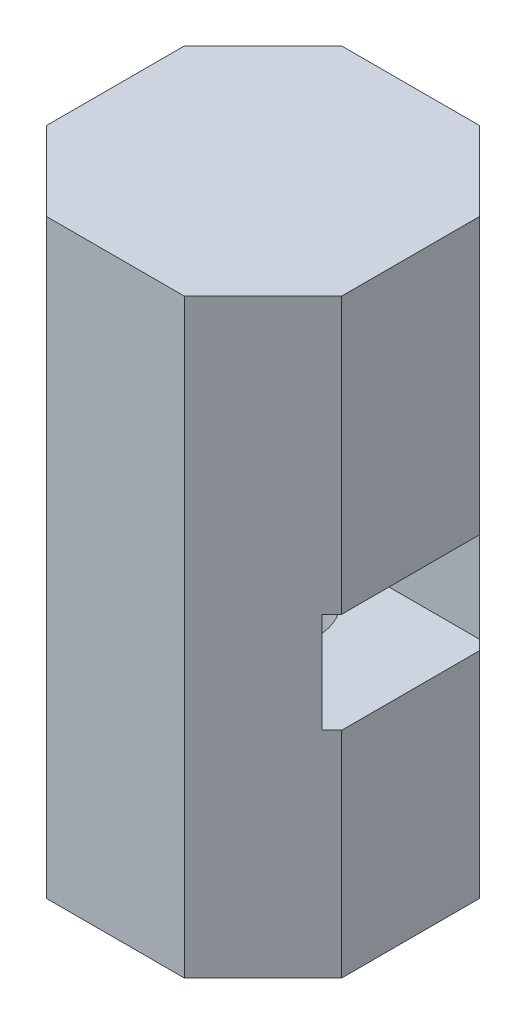
ISO-10303-21;
HEADER;
FILE_DESCRIPTION(('STEP AP214'),'2;1');
FILE_NAME('part.step','',(''),(''),'','','');
FILE_SCHEMA(('AUTOMOTIVE_DESIGN { 1 0 10303 214 1 1 1 1 }'));
ENDSEC;
DATA;
#1=APPLICATION_CONTEXT('core data for automotive mechanical design processes');
#2=APPLICATION_PROTOCOL_DEFINITION('international standard','automotive_design',2000,#1);
#3=PRODUCT_CONTEXT('',#1,'mechanical');
#4=PRODUCT('Part','Part','',(#3));
#5=PRODUCT_RELATED_PRODUCT_CATEGORY('part','',(#4));
#6=PRODUCT_DEFINITION_FORMATION('','',#4);
#7=PRODUCT_DEFINITION_CONTEXT('part definition',#1,'design');
#8=PRODUCT_DEFINITION('design','',#6,#7);
#9=PRODUCT_DEFINITION_SHAPE('','',#8);
#10=(LENGTH_UNIT() NAMED_UNIT(*) SI_UNIT(.MILLI.,.METRE.));
#11=(NAMED_UNIT(*) PLANE_ANGLE_UNIT() SI_UNIT($,.RADIAN.));
#12=(NAMED_UNIT(*) SI_UNIT($,.STERADIAN.) SOLID_ANGLE_UNIT());
#13=UNCERTAINTY_MEASURE_WITH_UNIT(LENGTH_MEASURE(1.E-05),#10,'distance_accuracy_value','');
#14=(GEOMETRIC_REPRESENTATION_CONTEXT(3) GLOBAL_UNCERTAINTY_ASSIGNED_CONTEXT((#13)) GLOBAL_UNIT_ASSIGNED_CONTEXT((#10,
#11,#12)) REPRESENTATION_CONTEXT('',''));
#15=CARTESIAN_POINT('',(0.,0.,0.));
#16=DIRECTION('',(0.,0.,1.));
#17=DIRECTION('',(1.,0.,0.));
#18=AXIS2_PLACEMENT_3D('',#15,#16,#17);
#19=CARTESIAN_POINT('',(3.99999999999999,0.,7.5));
#20=DIRECTION('',(-1.,0.,0.));
#21=DIRECTION('',(0.,-1.,0.));
#22=AXIS2_PLACEMENT_3D('',#19,#20,#21);
#23=PLANE('',#22);
#24=DIRECTION('',(0.,0.,-1.));
#25=VECTOR('',#24,1.);
#26=CARTESIAN_POINT('',(4.,-30.,7.5));
#27=LINE('',#26,#25);
#28=CARTESIAN_POINT('',(4.,-30.,3.49999999999997));
#29=VERTEX_POINT('',#28);
#30=CARTESIAN_POINT('',(4.,-30.,-3.49999999999992));
#31=VERTEX_POINT('',#30);
#32=EDGE_CURVE('E185',#29,#31,#27,.T.);
#33=ORIENTED_EDGE('',*,*,#32,.T.);
#34=DIRECTION('',(0.,1.,0.));
#35=VECTOR('',#34,1.);
#36=CARTESIAN_POINT('',(3.99999999999999,0.,-3.49999999999993));
#37=LINE('',#36,#35);
#38=CARTESIAN_POINT('',(3.99999999999999,-19.1,-3.49999999999994));
#39=VERTEX_POINT('',#38);
#40=EDGE_CURVE('E11',#31,#39,#37,.T.);
#41=ORIENTED_EDGE('',*,*,#40,.T.);
#42=DIRECTION('',(0.,0.,-1.));
#43=VECTOR('',#42,1.);
#44=CARTESIAN_POINT('',(3.99999999999999,-19.1,4.));
#45=LINE('',#44,#43);
#46=CARTESIAN_POINT('',(3.99999999999999,-19.1,3.49999999999997));
#47=VERTEX_POINT('',#46);
#48=EDGE_CURVE('E259',#47,#39,#45,.T.);
#49=ORIENTED_EDGE('',*,*,#48,.F.);
#50=DIRECTION('',(0.,-1.,0.));
#51=VECTOR('',#50,1.);
#52=CARTESIAN_POINT('',(3.99999999999999,0.,3.49999999999997));
#53=LINE('',#52,#51);
#54=EDGE_CURVE('E246',#47,#29,#53,.T.);
#55=ORIENTED_EDGE('',*,*,#54,.T.);
#56=EDGE_LOOP('',(#33,#41,#49,#55));
#57=FACE_BOUND('',#56,.T.);
#58=ADVANCED_FACE('F33',(#57),#23,.F.);
#59=CARTESIAN_POINT('',(-11.,-30.,7.5));
#60=DIRECTION('',(1.,0.,0.));
#61=DIRECTION('',(0.,1.,0.));
#62=AXIS2_PLACEMENT_3D('',#59,#60,#61);
#63=PLANE('',#62);
#64=DIRECTION('',(0.,0.,-1.));
#65=VECTOR('',#64,1.);
#66=CARTESIAN_POINT('',(-11.,-30.,7.5));
#67=LINE('',#66,#65);
#68=CARTESIAN_POINT('',(-11.,-30.,3.49999999999997));
#69=VERTEX_POINT('',#68);
#70=CARTESIAN_POINT('',(-11.,-30.,-3.49999999999992));
#71=VERTEX_POINT('',#70);
#72=EDGE_CURVE('E188',#69,#71,#67,.T.);
#73=ORIENTED_EDGE('',*,*,#72,.F.);
#74=DIRECTION('',(0.,1.,0.));
#75=VECTOR('',#74,1.);
#76=CARTESIAN_POINT('',(-11.,-30.,3.49999999999997));
#77=LINE('',#76,#75);
#78=CARTESIAN_POINT('',(-11.,-19.1,3.49999999999997));
#79=VERTEX_POINT('',#78);
#80=EDGE_CURVE('E213',#69,#79,#77,.T.);
#81=ORIENTED_EDGE('',*,*,#80,.T.);
#82=DIRECTION('',(0.,0.,1.));
#83=VECTOR('',#82,1.);
#84=CARTESIAN_POINT('',(-11.,-19.1,4.));
#85=LINE('',#84,#83);
#86=CARTESIAN_POINT('',(-11.,-19.1,-3.49999999999993));
#87=VERTEX_POINT('',#86);
#88=EDGE_CURVE('E287',#87,#79,#85,.T.);
#89=ORIENTED_EDGE('',*,*,#88,.F.);
#90=DIRECTION('',(0.,-1.,0.));
#91=VECTOR('',#90,1.);
#92=CARTESIAN_POINT('',(-11.,-30.,-3.49999999999993));
#93=LINE('',#92,#91);
#94=EDGE_CURVE('E206',#87,#71,#93,.T.);
#95=ORIENTED_EDGE('',*,*,#94,.T.);
#96=EDGE_LOOP('',(#73,#81,#89,#95));
#97=FACE_BOUND('',#96,.T.);
#98=ADVANCED_FACE('F343',(#97),#63,.F.);
#99=CARTESIAN_POINT('',(-11.,0.,7.5));
#100=DIRECTION('',(0.,-1.,0.));
#101=DIRECTION('',(1.,0.,0.));
#102=AXIS2_PLACEMENT_3D('',#99,#100,#101);
#103=PLANE('',#102);
#104=DIRECTION('',(0.,0.,-1.));
#105=VECTOR('',#104,1.);
#106=CARTESIAN_POINT('',(-11.,0.,7.5));
#107=LINE('',#106,#105);
#108=CARTESIAN_POINT('',(-11.,0.,3.49999999999997));
#109=VERTEX_POINT('',#108);
#110=CARTESIAN_POINT('',(-11.,0.,-3.49999999999992));
#111=VERTEX_POINT('',#110);
#112=EDGE_CURVE('E164',#109,#111,#107,.T.);
#113=ORIENTED_EDGE('',*,*,#112,.F.);
#114=DIRECTION('',(-0.707106781186551,0.,-0.707106781186544));
#115=VECTOR('',#114,1.);
#116=CARTESIAN_POINT('',(-6.99999999999992,0.,7.5));
#117=LINE('',#116,#115);
#118=CARTESIAN_POINT('',(-6.99999999999992,0.,7.5));
#119=VERTEX_POINT('',#118);
#120=EDGE_CURVE('E169',#109,#119,#117,.F.);
#121=ORIENTED_EDGE('',*,*,#120,.T.);
#122=DIRECTION('',(-1.,0.,0.));
#123=VECTOR('',#122,1.);
#124=CARTESIAN_POINT('',(-11.,0.,7.5));
#125=LINE('',#124,#123);
#126=CARTESIAN_POINT('',(0.,0.,7.5));
#127=VERTEX_POINT('',#126);
#128=EDGE_CURVE('E159',#127,#119,#125,.T.);
#129=ORIENTED_EDGE('',*,*,#128,.F.);
#130=DIRECTION('',(-0.707106781186551,0.,0.707106781186544));
#131=VECTOR('',#130,1.);
#132=CARTESIAN_POINT('',(0.,0.,7.5));
#133=LINE('',#132,#131);
#134=CARTESIAN_POINT('',(3.99999999999999,0.,3.49999999999997));
#135=VERTEX_POINT('',#134);
#136=EDGE_CURVE('E54',#127,#135,#133,.F.);
#137=ORIENTED_EDGE('',*,*,#136,.T.);
#138=DIRECTION('',(0.,0.,-1.));
#139=VECTOR('',#138,1.);
#140=CARTESIAN_POINT('',(3.99999999999999,0.,7.5));
#141=LINE('',#140,#139);
#142=CARTESIAN_POINT('',(3.99999999999999,0.,-3.49999999999992));
#143=VERTEX_POINT('',#142);
#144=EDGE_CURVE('E172',#135,#143,#141,.T.);
#145=ORIENTED_EDGE('',*,*,#144,.T.);
#146=DIRECTION('',(-0.707106781186544,0.,-0.707106781186551));
#147=VECTOR('',#146,1.);
#148=CARTESIAN_POINT('',(3.99999999999999,0.,-3.49999999999993));
#149=LINE('',#148,#147);
#150=CARTESIAN_POINT('',(0.,0.,-7.5));
#151=VERTEX_POINT('',#150);
#152=EDGE_CURVE('E151',#143,#151,#149,.T.);
#153=ORIENTED_EDGE('',*,*,#152,.T.);
#154=DIRECTION('',(-1.,0.,0.));
#155=VECTOR('',#154,1.);
#156=CARTESIAN_POINT('',(-11.,0.,-7.5));
#157=LINE('',#156,#155);
#158=CARTESIAN_POINT('',(-6.99999999999997,0.,-7.5));
#159=VERTEX_POINT('',#158);
#160=EDGE_CURVE('E175',#151,#159,#157,.T.);
#161=ORIENTED_EDGE('',*,*,#160,.T.);
#162=DIRECTION('',(-0.707106781186544,0.,0.707106781186551));
#163=VECTOR('',#162,1.);
#164=CARTESIAN_POINT('',(-11.,0.,-3.49999999999993));
#165=LINE('',#164,#163);
#166=EDGE_CURVE('E235',#159,#111,#165,.T.);
#167=ORIENTED_EDGE('',*,*,#166,.T.);
#168=EDGE_LOOP('',(#113,#121,#129,#137,#145,#153,#161,#167));
#169=FACE_BOUND('',#168,.T.);
#170=ADVANCED_FACE('F167',(#169),#103,.F.);
#171=DIRECTION('',(0.,0.,-1.));
#172=VECTOR('',#171,1.);
#173=CARTESIAN_POINT('',(-11.,-14.,4.));
#174=LINE('',#173,#172);
#175=CARTESIAN_POINT('',(-11.,-14.,3.49999999999997));
#176=VERTEX_POINT('',#175);
#177=CARTESIAN_POINT('',(-11.,-14.,-3.49999999999993));
#178=VERTEX_POINT('',#177);
#179=EDGE_CURVE('E308',#176,#178,#174,.T.);
#180=ORIENTED_EDGE('',*,*,#179,.F.);
#181=DIRECTION('',(0.,1.,0.));
#182=VECTOR('',#181,1.);
#183=CARTESIAN_POINT('',(-11.,-30.,3.49999999999997));
#184=LINE('',#183,#182);
#185=EDGE_CURVE('E211',#176,#109,#184,.T.);
#186=ORIENTED_EDGE('',*,*,#185,.T.);
#187=ORIENTED_EDGE('',*,*,#112,.T.);
#188=DIRECTION('',(0.,-1.,0.));
#189=VECTOR('',#188,1.);
#190=CARTESIAN_POINT('',(-11.,-30.,-3.49999999999993));
#191=LINE('',#190,#189);
#192=EDGE_CURVE('E208',#111,#178,#191,.T.);
#193=ORIENTED_EDGE('',*,*,#192,.T.);
#194=EDGE_LOOP('',(#180,#186,#187,#193));
#195=FACE_BOUND('',#194,.T.);
#196=ADVANCED_FACE('F302',(#195),#63,.F.);
#197=CARTESIAN_POINT('',(4.,-30.,7.5));
#198=DIRECTION('',(0.,1.,0.));
#199=DIRECTION('',(-1.,0.,0.));
#200=AXIS2_PLACEMENT_3D('',#197,#198,#199);
#201=PLANE('',#200);
#202=CARTESIAN_POINT('',(-3.5,-30.,0.));
#203=DIRECTION('',(0.,-1.,0.));
#204=DIRECTION('',(1.,0.,0.));
#205=AXIS2_PLACEMENT_3D('',#202,#203,#204);
#206=CIRCLE('',#205,5.25);
#207=CARTESIAN_POINT('',(1.75,-30.,0.));
#208=VERTEX_POINT('',#207);
#209=EDGE_CURVE('E178',#208,#208,#206,.T.);
#210=ORIENTED_EDGE('',*,*,#209,.F.);
#211=EDGE_LOOP('',(#210));
#212=FACE_BOUND('',#211,.T.);
#213=DIRECTION('',(1.,0.,0.));
#214=VECTOR('',#213,1.);
#215=CARTESIAN_POINT('',(4.,-30.,7.5));
#216=LINE('',#215,#214);
#217=CARTESIAN_POINT('',(-6.99999999999992,-30.,7.5));
#218=VERTEX_POINT('',#217);
#219=CARTESIAN_POINT('',(0.,-30.,7.5));
#220=VERTEX_POINT('',#219);
#221=EDGE_CURVE('E162',#218,#220,#216,.T.);
#222=ORIENTED_EDGE('',*,*,#221,.F.);
#223=DIRECTION('',(0.707106781186551,0.,0.707106781186544));
#224=VECTOR('',#223,1.);
#225=CARTESIAN_POINT('',(-6.99999999999992,-30.,7.5));
#226=LINE('',#225,#224);
#227=EDGE_CURVE('E204',#218,#69,#226,.F.);
#228=ORIENTED_EDGE('',*,*,#227,.T.);
#229=ORIENTED_EDGE('',*,*,#72,.T.);
#230=DIRECTION('',(0.707106781186544,0.,-0.707106781186551));
#231=VECTOR('',#230,1.);
#232=CARTESIAN_POINT('',(-11.,-30.,-3.49999999999993));
#233=LINE('',#232,#231);
#234=CARTESIAN_POINT('',(-6.99999999999996,-30.,-7.5));
#235=VERTEX_POINT('',#234);
#236=EDGE_CURVE('E202',#71,#235,#233,.T.);
#237=ORIENTED_EDGE('',*,*,#236,.T.);
#238=DIRECTION('',(1.,0.,0.));
#239=VECTOR('',#238,1.);
#240=CARTESIAN_POINT('',(4.,-30.,-7.5));
#241=LINE('',#240,#239);
#242=CARTESIAN_POINT('',(0.,-30.,-7.5));
#243=VERTEX_POINT('',#242);
#244=EDGE_CURVE('E170',#235,#243,#241,.T.);
#245=ORIENTED_EDGE('',*,*,#244,.T.);
#246=DIRECTION('',(0.707106781186544,0.,0.707106781186551));
#247=VECTOR('',#246,1.);
#248=CARTESIAN_POINT('',(4.,-30.,-3.49999999999993));
#249=LINE('',#248,#247);
#250=EDGE_CURVE('E200',#243,#31,#249,.T.);
#251=ORIENTED_EDGE('',*,*,#250,.T.);
#252=ORIENTED_EDGE('',*,*,#32,.F.);
#253=DIRECTION('',(0.707106781186551,0.,-0.707106781186544));
#254=VECTOR('',#253,1.);
#255=CARTESIAN_POINT('',(0.,-30.,7.5));
#256=LINE('',#255,#254);
#257=EDGE_CURVE('E198',#29,#220,#256,.F.);
#258=ORIENTED_EDGE('',*,*,#257,.T.);
#259=EDGE_LOOP('',(#222,#228,#229,#237,#245,#251,#252,#258));
#260=FACE_BOUND('',#259,.T.);
#261=ADVANCED_FACE('F299',(#212,#260),#201,.F.);
#262=DIRECTION('',(0.,0.,1.));
#263=VECTOR('',#262,1.);
#264=CARTESIAN_POINT('',(3.99999999999999,-14.,4.));
#265=LINE('',#264,#263);
#266=CARTESIAN_POINT('',(3.99999999999999,-14.,-3.49999999999993));
#267=VERTEX_POINT('',#266);
#268=CARTESIAN_POINT('',(3.99999999999999,-14.,3.49999999999997));
#269=VERTEX_POINT('',#268);
#270=EDGE_CURVE('E250',#267,#269,#265,.T.);
#271=ORIENTED_EDGE('',*,*,#270,.F.);
#272=DIRECTION('',(0.,1.,0.));
#273=VECTOR('',#272,1.);
#274=CARTESIAN_POINT('',(3.99999999999999,0.,-3.49999999999993));
#275=LINE('',#274,#273);
#276=EDGE_CURVE('E41',#267,#143,#275,.T.);
#277=ORIENTED_EDGE('',*,*,#276,.T.);
#278=ORIENTED_EDGE('',*,*,#144,.F.);
#279=DIRECTION('',(0.,-1.,0.));
#280=VECTOR('',#279,1.);
#281=CARTESIAN_POINT('',(3.99999999999999,0.,3.49999999999997));
#282=LINE('',#281,#280);
#283=EDGE_CURVE('E150',#135,#269,#282,.T.);
#284=ORIENTED_EDGE('',*,*,#283,.T.);
#285=EDGE_LOOP('',(#271,#277,#278,#284));
#286=FACE_BOUND('',#285,.T.);
#287=ADVANCED_FACE('F249',(#286),#23,.F.);
#288=CARTESIAN_POINT('',(0.,0.,7.5));
#289=DIRECTION('',(0.,0.,-1.));
#290=DIRECTION('',(-1.,0.,0.));
#291=AXIS2_PLACEMENT_3D('',#288,#289,#290);
#292=PLANE('',#291);
#293=ORIENTED_EDGE('',*,*,#128,.T.);
#294=DIRECTION('',(0.,-1.,0.));
#295=VECTOR('',#294,1.);
#296=CARTESIAN_POINT('',(-6.99999999999992,0.,7.5));
#297=LINE('',#296,#295);
#298=EDGE_CURVE('E163',#119,#218,#297,.T.);
#299=ORIENTED_EDGE('',*,*,#298,.T.);
#300=ORIENTED_EDGE('',*,*,#221,.T.);
#301=DIRECTION('',(0.,1.,0.));
#302=VECTOR('',#301,1.);
#303=CARTESIAN_POINT('',(0.,0.,7.5));
#304=LINE('',#303,#302);
#305=EDGE_CURVE('E149',#220,#127,#304,.T.);
#306=ORIENTED_EDGE('',*,*,#305,.T.);
#307=EDGE_LOOP('',(#293,#299,#300,#306));
#308=FACE_BOUND('',#307,.T.);
#309=ADVANCED_FACE('F157',(#308),#292,.F.);
#310=CARTESIAN_POINT('',(0.,0.,-7.5));
#311=DIRECTION('',(0.,0.,-1.));
#312=DIRECTION('',(-1.,0.,0.));
#313=AXIS2_PLACEMENT_3D('',#310,#311,#312);
#314=PLANE('',#313);
#315=ORIENTED_EDGE('',*,*,#244,.F.);
#316=DIRECTION('',(0.,1.,0.));
#317=VECTOR('',#316,1.);
#318=CARTESIAN_POINT('',(-6.99999999999997,0.,-7.5));
#319=LINE('',#318,#317);
#320=EDGE_CURVE('E244',#235,#159,#319,.T.);
#321=ORIENTED_EDGE('',*,*,#320,.T.);
#322=ORIENTED_EDGE('',*,*,#160,.F.);
#323=DIRECTION('',(0.,-1.,0.));
#324=VECTOR('',#323,1.);
#325=CARTESIAN_POINT('',(0.,-30.,-7.5));
#326=LINE('',#325,#324);
#327=EDGE_CURVE('E242',#151,#243,#326,.T.);
#328=ORIENTED_EDGE('',*,*,#327,.T.);
#329=EDGE_LOOP('',(#315,#321,#322,#328));
#330=FACE_BOUND('',#329,.T.);
#331=ADVANCED_FACE('F327',(#330),#314,.T.);
#332=CARTESIAN_POINT('',(-3.5,-24.,0.));
#333=DIRECTION('',(0.,-1.,0.));
#334=DIRECTION('',(1.,0.,0.));
#335=AXIS2_PLACEMENT_3D('',#332,#333,#334);
#336=CYLINDRICAL_SURFACE('',#335,5.25);
#337=CARTESIAN_POINT('',(-3.5,-24.,0.));
#338=DIRECTION('',(0.,-1.,0.));
#339=DIRECTION('',(1.,0.,0.));
#340=AXIS2_PLACEMENT_3D('',#337,#338,#339);
#341=CIRCLE('',#340,5.25);
#342=CARTESIAN_POINT('',(1.75,-24.,0.));
#343=VERTEX_POINT('',#342);
#344=EDGE_CURVE('E182',#343,#343,#341,.T.);
#345=ORIENTED_EDGE('',*,*,#344,.F.);
#346=EDGE_LOOP('',(#345));
#347=FACE_BOUND('',#346,.T.);
#348=ORIENTED_EDGE('',*,*,#209,.T.);
#349=EDGE_LOOP('',(#348));
#350=FACE_BOUND('',#349,.T.);
#351=ADVANCED_FACE('F297',(#347,#350),#336,.F.);
#352=CARTESIAN_POINT('',(-3.5,-24.,0.));
#353=DIRECTION('',(0.,-1.,0.));
#354=DIRECTION('',(1.,0.,0.));
#355=AXIS2_PLACEMENT_3D('',#352,#353,#354);
#356=PLANE('',#355);
#357=CARTESIAN_POINT('',(-3.5,-24.,0.));
#358=DIRECTION('',(0.,-1.,0.));
#359=DIRECTION('',(1.,0.,0.));
#360=AXIS2_PLACEMENT_3D('',#357,#358,#359);
#361=CIRCLE('',#360,2.75);
#362=CARTESIAN_POINT('',(-0.749999999999998,-24.,0.));
#363=VERTEX_POINT('',#362);
#364=EDGE_CURVE('E193',#363,#363,#361,.T.);
#365=ORIENTED_EDGE('',*,*,#364,.F.);
#366=EDGE_LOOP('',(#365));
#367=FACE_BOUND('',#366,.T.);
#368=ORIENTED_EDGE('',*,*,#344,.T.);
#369=EDGE_LOOP('',(#368));
#370=FACE_BOUND('',#369,.T.);
#371=ADVANCED_FACE('F375',(#367,#370),#356,.T.);
#372=CARTESIAN_POINT('',(-3.5,-1.99999999999999,0.));
#373=DIRECTION('',(0.,-1.,0.));
#374=DIRECTION('',(1.,0.,0.));
#375=AXIS2_PLACEMENT_3D('',#372,#373,#374);
#376=CYLINDRICAL_SURFACE('',#375,2.75);
#377=CARTESIAN_POINT('',(-3.5,-19.1,0.));
#378=DIRECTION('',(0.,-1.,0.));
#379=DIRECTION('',(0.,0.,-1.));
#380=AXIS2_PLACEMENT_3D('',#377,#378,#379);
#381=CIRCLE('',#380,2.75);
#382=CARTESIAN_POINT('',(-3.5,-19.1,-2.75));
#383=VERTEX_POINT('',#382);
#384=EDGE_CURVE('E284',#383,#383,#381,.T.);
#385=ORIENTED_EDGE('',*,*,#384,.F.);
#386=EDGE_LOOP('',(#385));
#387=FACE_BOUND('',#386,.T.);
#388=ORIENTED_EDGE('',*,*,#364,.T.);
#389=EDGE_LOOP('',(#388));
#390=FACE_BOUND('',#389,.T.);
#391=ADVANCED_FACE('F354',(#387,#390),#376,.F.);
#392=CARTESIAN_POINT('',(-11.001,-14.,4.));
#393=DIRECTION('',(0.,0.,1.));
#394=DIRECTION('',(0.,-1.,0.));
#395=AXIS2_PLACEMENT_3D('',#392,#393,#394);
#396=PLANE('',#395);
#397=DIRECTION('',(1.,0.,0.));
#398=VECTOR('',#397,1.);
#399=CARTESIAN_POINT('',(-11.001,-19.1,4.));
#400=LINE('',#399,#398);
#401=CARTESIAN_POINT('',(-10.5,-19.1,4.));
#402=VERTEX_POINT('',#401);
#403=CARTESIAN_POINT('',(3.49999999999996,-19.1,4.));
#404=VERTEX_POINT('',#403);
#405=EDGE_CURVE('E258',#402,#404,#400,.T.);
#406=ORIENTED_EDGE('',*,*,#405,.F.);
#407=DIRECTION('',(0.,-1.,0.));
#408=VECTOR('',#407,1.);
#409=CARTESIAN_POINT('',(-10.5,0.,4.));
#410=LINE('',#409,#408);
#411=CARTESIAN_POINT('',(-10.5,-14.,4.));
#412=VERTEX_POINT('',#411);
#413=EDGE_CURVE('E225',#402,#412,#410,.F.);
#414=ORIENTED_EDGE('',*,*,#413,.T.);
#415=DIRECTION('',(1.,0.,0.));
#416=VECTOR('',#415,1.);
#417=CARTESIAN_POINT('',(-11.001,-14.,4.));
#418=LINE('',#417,#416);
#419=CARTESIAN_POINT('',(3.49999999999996,-14.,4.));
#420=VERTEX_POINT('',#419);
#421=EDGE_CURVE('E269',#412,#420,#418,.T.);
#422=ORIENTED_EDGE('',*,*,#421,.T.);
#423=DIRECTION('',(0.,1.,0.));
#424=VECTOR('',#423,1.);
#425=CARTESIAN_POINT('',(3.49999999999996,0.,4.));
#426=LINE('',#425,#424);
#427=EDGE_CURVE('E223',#420,#404,#426,.F.);
#428=ORIENTED_EDGE('',*,*,#427,.T.);
#429=EDGE_LOOP('',(#406,#414,#422,#428));
#430=FACE_BOUND('',#429,.T.);
#431=ADVANCED_FACE('F267',(#430),#396,.F.);
#432=CARTESIAN_POINT('',(-11.001,-14.,-4.));
#433=DIRECTION('',(0.,0.,-1.));
#434=DIRECTION('',(0.,1.,0.));
#435=AXIS2_PLACEMENT_3D('',#432,#433,#434);
#436=PLANE('',#435);
#437=DIRECTION('',(1.,0.,0.));
#438=VECTOR('',#437,1.);
#439=CARTESIAN_POINT('',(-11.001,-14.,-4.));
#440=LINE('',#439,#438);
#441=CARTESIAN_POINT('',(-10.4999999999999,-14.,-4.));
#442=VERTEX_POINT('',#441);
#443=CARTESIAN_POINT('',(3.49999999999993,-14.,-4.));
#444=VERTEX_POINT('',#443);
#445=EDGE_CURVE('E280',#442,#444,#440,.T.);
#446=ORIENTED_EDGE('',*,*,#445,.F.);
#447=DIRECTION('',(0.,-1.,0.));
#448=VECTOR('',#447,1.);
#449=CARTESIAN_POINT('',(-10.4999999999999,-30.,-4.));
#450=LINE('',#449,#448);
#451=CARTESIAN_POINT('',(-10.4999999999999,-19.1,-4.));
#452=VERTEX_POINT('',#451);
#453=EDGE_CURVE('E240',#442,#452,#450,.T.);
#454=ORIENTED_EDGE('',*,*,#453,.T.);
#455=DIRECTION('',(1.,0.,0.));
#456=VECTOR('',#455,1.);
#457=CARTESIAN_POINT('',(-11.001,-19.1,-4.));
#458=LINE('',#457,#456);
#459=CARTESIAN_POINT('',(3.49999999999993,-19.1,-4.));
#460=VERTEX_POINT('',#459);
#461=EDGE_CURVE('E277',#452,#460,#458,.T.);
#462=ORIENTED_EDGE('',*,*,#461,.T.);
#463=DIRECTION('',(0.,1.,0.));
#464=VECTOR('',#463,1.);
#465=CARTESIAN_POINT('',(3.49999999999993,0.,-4.));
#466=LINE('',#465,#464);
#467=EDGE_CURVE('E238',#460,#444,#466,.T.);
#468=ORIENTED_EDGE('',*,*,#467,.T.);
#469=EDGE_LOOP('',(#446,#454,#462,#468));
#470=FACE_BOUND('',#469,.T.);
#471=ADVANCED_FACE('F346',(#470),#436,.F.);
#472=CARTESIAN_POINT('',(-11.001,-14.,4.));
#473=DIRECTION('',(0.,1.,0.));
#474=DIRECTION('',(0.,0.,1.));
#475=AXIS2_PLACEMENT_3D('',#472,#473,#474);
#476=PLANE('',#475);
#477=ORIENTED_EDGE('',*,*,#421,.F.);
#478=DIRECTION('',(0.707106781186551,0.,0.707106781186544));
#479=VECTOR('',#478,1.);
#480=CARTESIAN_POINT('',(-6.99999999999992,-14.,7.5));
#481=LINE('',#480,#479);
#482=EDGE_CURVE('E152',#412,#176,#481,.F.);
#483=ORIENTED_EDGE('',*,*,#482,.T.);
#484=ORIENTED_EDGE('',*,*,#179,.T.);
#485=DIRECTION('',(0.707106781186544,0.,-0.707106781186551));
#486=VECTOR('',#485,1.);
#487=CARTESIAN_POINT('',(-11.,-14.,-3.49999999999993));
#488=LINE('',#487,#486);
#489=EDGE_CURVE('E231',#178,#442,#488,.T.);
#490=ORIENTED_EDGE('',*,*,#489,.T.);
#491=ORIENTED_EDGE('',*,*,#445,.T.);
#492=DIRECTION('',(0.707106781186544,0.,0.707106781186551));
#493=VECTOR('',#492,1.);
#494=CARTESIAN_POINT('',(3.99999999999999,-14.,-3.49999999999993));
#495=LINE('',#494,#493);
#496=EDGE_CURVE('E229',#444,#267,#495,.T.);
#497=ORIENTED_EDGE('',*,*,#496,.T.);
#498=ORIENTED_EDGE('',*,*,#270,.T.);
#499=DIRECTION('',(0.707106781186551,0.,-0.707106781186544));
#500=VECTOR('',#499,1.);
#501=CARTESIAN_POINT('',(0.,-14.,7.5));
#502=LINE('',#501,#500);
#503=EDGE_CURVE('E227',#269,#420,#502,.F.);
#504=ORIENTED_EDGE('',*,*,#503,.T.);
#505=EDGE_LOOP('',(#477,#483,#484,#490,#491,#497,#498,#504));
#506=FACE_BOUND('',#505,.T.);
#507=CARTESIAN_POINT('',(-3.5,-14.,0.));
#508=DIRECTION('',(0.,1.,0.));
#509=DIRECTION('',(0.,0.,1.));
#510=AXIS2_PLACEMENT_3D('',#507,#508,#509);
#511=CIRCLE('',#510,2.75);
#512=CARTESIAN_POINT('',(-3.5,-14.,2.75));
#513=VERTEX_POINT('',#512);
#514=EDGE_CURVE('E289',#513,#513,#511,.T.);
#515=ORIENTED_EDGE('',*,*,#514,.T.);
#516=EDGE_LOOP('',(#515));
#517=FACE_BOUND('',#516,.T.);
#518=ADVANCED_FACE('F253',(#506,#517),#476,.F.);
#519=CARTESIAN_POINT('',(-11.001,-19.1,4.));
#520=DIRECTION('',(0.,-1.,0.));
#521=DIRECTION('',(0.,0.,-1.));
#522=AXIS2_PLACEMENT_3D('',#519,#520,#521);
#523=PLANE('',#522);
#524=ORIENTED_EDGE('',*,*,#88,.T.);
#525=DIRECTION('',(-0.707106781186551,0.,-0.707106781186544));
#526=VECTOR('',#525,1.);
#527=CARTESIAN_POINT('',(-6.99999999999992,-19.1,7.5));
#528=LINE('',#527,#526);
#529=EDGE_CURVE('E221',#79,#402,#528,.F.);
#530=ORIENTED_EDGE('',*,*,#529,.T.);
#531=ORIENTED_EDGE('',*,*,#405,.T.);
#532=DIRECTION('',(-0.707106781186551,0.,0.707106781186544));
#533=VECTOR('',#532,1.);
#534=CARTESIAN_POINT('',(0.,-19.1,7.5));
#535=LINE('',#534,#533);
#536=EDGE_CURVE('E215',#404,#47,#535,.F.);
#537=ORIENTED_EDGE('',*,*,#536,.T.);
#538=ORIENTED_EDGE('',*,*,#48,.T.);
#539=DIRECTION('',(-0.707106781186544,0.,-0.707106781186551));
#540=VECTOR('',#539,1.);
#541=CARTESIAN_POINT('',(3.99999999999999,-19.1,-3.49999999999993));
#542=LINE('',#541,#540);
#543=EDGE_CURVE('E217',#39,#460,#542,.T.);
#544=ORIENTED_EDGE('',*,*,#543,.T.);
#545=ORIENTED_EDGE('',*,*,#461,.F.);
#546=DIRECTION('',(-0.707106781186544,0.,0.707106781186551));
#547=VECTOR('',#546,1.);
#548=CARTESIAN_POINT('',(-11.,-19.1,-3.49999999999993));
#549=LINE('',#548,#547);
#550=EDGE_CURVE('E219',#452,#87,#549,.T.);
#551=ORIENTED_EDGE('',*,*,#550,.T.);
#552=EDGE_LOOP('',(#524,#530,#531,#537,#538,#544,#545,#551));
#553=FACE_BOUND('',#552,.T.);
#554=ORIENTED_EDGE('',*,*,#384,.T.);
#555=EDGE_LOOP('',(#554));
#556=FACE_BOUND('',#555,.T.);
#557=ADVANCED_FACE('F272',(#553,#556),#523,.F.);
#558=CARTESIAN_POINT('',(-3.5,-1.99999999999999,0.));
#559=DIRECTION('',(0.,-1.,0.));
#560=DIRECTION('',(1.,0.,0.));
#561=AXIS2_PLACEMENT_3D('',#558,#559,#560);
#562=PLANE('',#561);
#563=CARTESIAN_POINT('',(-3.5,-1.99999999999999,0.));
#564=DIRECTION('',(0.,-1.,0.));
#565=DIRECTION('',(1.,0.,0.));
#566=AXIS2_PLACEMENT_3D('',#563,#564,#565);
#567=CIRCLE('',#566,2.75);
#568=CARTESIAN_POINT('',(-0.750000000000003,-1.99999999999999,0.));
#569=VERTEX_POINT('',#568);
#570=EDGE_CURVE('E195',#569,#569,#567,.T.);
#571=ORIENTED_EDGE('',*,*,#570,.T.);
#572=EDGE_LOOP('',(#571));
#573=FACE_BOUND('',#572,.T.);
#574=ADVANCED_FACE('F384',(#573),#562,.T.);
#575=ORIENTED_EDGE('',*,*,#514,.F.);
#576=EDGE_LOOP('',(#575));
#577=FACE_BOUND('',#576,.T.);
#578=ORIENTED_EDGE('',*,*,#570,.F.);
#579=EDGE_LOOP('',(#578));
#580=FACE_BOUND('',#579,.T.);
#581=ADVANCED_FACE('F383',(#577,#580),#376,.F.);
#582=CARTESIAN_POINT('',(-6.99999999999992,0.,7.5));
#583=DIRECTION('',(0.707106781186544,0.,-0.707106781186551));
#584=DIRECTION('',(0.,-1.,0.));
#585=AXIS2_PLACEMENT_3D('',#582,#583,#584);
#586=PLANE('',#585);
#587=ORIENTED_EDGE('',*,*,#529,.F.);
#588=ORIENTED_EDGE('',*,*,#80,.F.);
#589=ORIENTED_EDGE('',*,*,#227,.F.);
#590=ORIENTED_EDGE('',*,*,#298,.F.);
#591=ORIENTED_EDGE('',*,*,#120,.F.);
#592=ORIENTED_EDGE('',*,*,#185,.F.);
#593=ORIENTED_EDGE('',*,*,#482,.F.);
#594=ORIENTED_EDGE('',*,*,#413,.F.);
#595=EDGE_LOOP('',(#587,#588,#589,#590,#591,#592,#593,#594));
#596=FACE_BOUND('',#595,.T.);
#597=ADVANCED_FACE('F339',(#596),#586,.F.);
#598=CARTESIAN_POINT('',(-11.,-30.,-3.49999999999993));
#599=DIRECTION('',(-0.707106781186551,0.,-0.707106781186544));
#600=DIRECTION('',(0.,1.,0.));
#601=AXIS2_PLACEMENT_3D('',#598,#599,#600);
#602=PLANE('',#601);
#603=ORIENTED_EDGE('',*,*,#166,.F.);
#604=ORIENTED_EDGE('',*,*,#320,.F.);
#605=ORIENTED_EDGE('',*,*,#236,.F.);
#606=ORIENTED_EDGE('',*,*,#94,.F.);
#607=ORIENTED_EDGE('',*,*,#550,.F.);
#608=ORIENTED_EDGE('',*,*,#453,.F.);
#609=ORIENTED_EDGE('',*,*,#489,.F.);
#610=ORIENTED_EDGE('',*,*,#192,.F.);
#611=EDGE_LOOP('',(#603,#604,#605,#606,#607,#608,#609,#610));
#612=FACE_BOUND('',#611,.T.);
#613=ADVANCED_FACE('F331',(#612),#602,.T.);
#614=CARTESIAN_POINT('',(3.99999999999999,0.,-3.49999999999993));
#615=DIRECTION('',(0.707106781186551,0.,-0.707106781186544));
#616=DIRECTION('',(0.,-1.,0.));
#617=AXIS2_PLACEMENT_3D('',#614,#615,#616);
#618=PLANE('',#617);
#619=ORIENTED_EDGE('',*,*,#250,.F.);
#620=ORIENTED_EDGE('',*,*,#327,.F.);
#621=ORIENTED_EDGE('',*,*,#152,.F.);
#622=ORIENTED_EDGE('',*,*,#276,.F.);
#623=ORIENTED_EDGE('',*,*,#496,.F.);
#624=ORIENTED_EDGE('',*,*,#467,.F.);
#625=ORIENTED_EDGE('',*,*,#543,.F.);
#626=ORIENTED_EDGE('',*,*,#40,.F.);
#627=EDGE_LOOP('',(#619,#620,#621,#622,#623,#624,#625,#626));
#628=FACE_BOUND('',#627,.T.);
#629=ADVANCED_FACE('F320',(#628),#618,.T.);
#630=CARTESIAN_POINT('',(0.,0.,7.5));
#631=DIRECTION('',(-0.707106781186544,0.,-0.707106781186551));
#632=DIRECTION('',(0.,1.,0.));
#633=AXIS2_PLACEMENT_3D('',#630,#631,#632);
#634=PLANE('',#633);
#635=ORIENTED_EDGE('',*,*,#503,.F.);
#636=ORIENTED_EDGE('',*,*,#283,.F.);
#637=ORIENTED_EDGE('',*,*,#136,.F.);
#638=ORIENTED_EDGE('',*,*,#305,.F.);
#639=ORIENTED_EDGE('',*,*,#257,.F.);
#640=ORIENTED_EDGE('',*,*,#54,.F.);
#641=ORIENTED_EDGE('',*,*,#536,.F.);
#642=ORIENTED_EDGE('',*,*,#427,.F.);
#643=EDGE_LOOP('',(#635,#636,#637,#638,#639,#640,#641,#642));
#644=FACE_BOUND('',#643,.T.);
#645=ADVANCED_FACE('F35',(#644),#634,.F.);
#646=CLOSED_SHELL('',(#58,#98,#170,#196,#261,#287,#309,#331,#351,#371,#391,#431,#471,#518,#557,
#574,#581,#597,#613,#629,#645));
#647=MANIFOLD_SOLID_BREP('B2',#646);
#648=ADVANCED_BREP_SHAPE_REPRESENTATION('',(#18,#647),#14);
#649=SHAPE_DEFINITION_REPRESENTATION(#9,#648);
ENDSEC;
END-ISO-10303-21;
